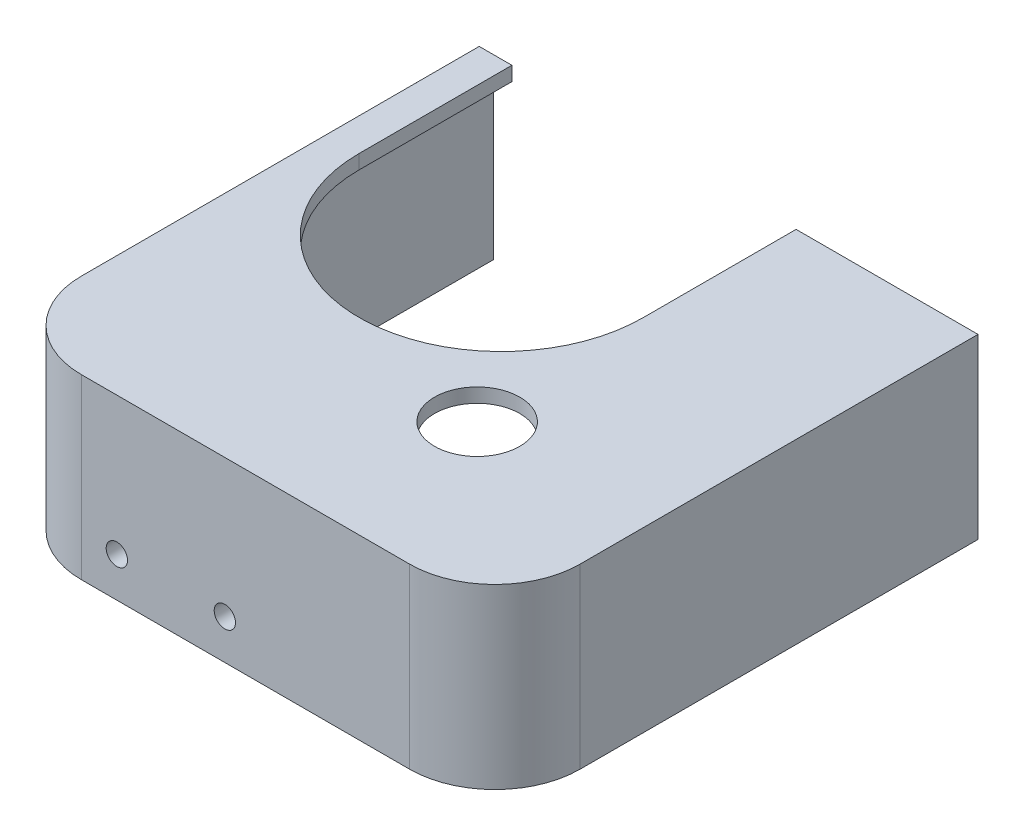
ISO-10303-21;
HEADER;
FILE_DESCRIPTION(('STEP AP214'),'2;1');
FILE_NAME('part.step','',(''),(''),'','','');
FILE_SCHEMA(('AUTOMOTIVE_DESIGN { 1 0 10303 214 1 1 1 1 }'));
ENDSEC;
DATA;
#1=APPLICATION_CONTEXT('core data for automotive mechanical design processes');
#2=APPLICATION_PROTOCOL_DEFINITION('international standard','automotive_design',2000,#1);
#3=PRODUCT_CONTEXT('',#1,'mechanical');
#4=PRODUCT('Part','Part','',(#3));
#5=PRODUCT_RELATED_PRODUCT_CATEGORY('part','',(#4));
#6=PRODUCT_DEFINITION_FORMATION('','',#4);
#7=PRODUCT_DEFINITION_CONTEXT('part definition',#1,'design');
#8=PRODUCT_DEFINITION('design','',#6,#7);
#9=PRODUCT_DEFINITION_SHAPE('','',#8);
#10=(LENGTH_UNIT() NAMED_UNIT(*) SI_UNIT(.MILLI.,.METRE.));
#11=(NAMED_UNIT(*) PLANE_ANGLE_UNIT() SI_UNIT($,.RADIAN.));
#12=(NAMED_UNIT(*) SI_UNIT($,.STERADIAN.) SOLID_ANGLE_UNIT());
#13=UNCERTAINTY_MEASURE_WITH_UNIT(LENGTH_MEASURE(1.E-05),#10,'distance_accuracy_value','');
#14=(GEOMETRIC_REPRESENTATION_CONTEXT(3) GLOBAL_UNCERTAINTY_ASSIGNED_CONTEXT((#13)) GLOBAL_UNIT_ASSIGNED_CONTEXT((#10,
#11,#12)) REPRESENTATION_CONTEXT('',''));
#15=CARTESIAN_POINT('',(0.,0.,0.));
#16=DIRECTION('',(0.,0.,1.));
#17=DIRECTION('',(1.,0.,0.));
#18=AXIS2_PLACEMENT_3D('',#15,#16,#17);
#19=CARTESIAN_POINT('',(-0.499999999999999,-13.5,-21.75));
#20=DIRECTION('',(-1.,0.,0.));
#21=DIRECTION('',(0.,0.,1.));
#22=AXIS2_PLACEMENT_3D('',#19,#20,#21);
#23=PLANE('',#22);
#24=DIRECTION('',(0.,-1.,0.));
#25=VECTOR('',#24,1.);
#26=CARTESIAN_POINT('',(-0.499999999999997,-13.5,-32.5));
#27=LINE('',#26,#25);
#28=CARTESIAN_POINT('',(-0.499999999999997,-12.5,-32.5));
#29=VERTEX_POINT('',#28);
#30=CARTESIAN_POINT('',(-0.499999999999997,-13.5,-32.5));
#31=VERTEX_POINT('',#30);
#32=EDGE_CURVE('E390',#29,#31,#27,.T.);
#33=ORIENTED_EDGE('',*,*,#32,.T.);
#34=DIRECTION('',(0.,0.,-1.));
#35=VECTOR('',#34,1.);
#36=CARTESIAN_POINT('',(-0.500000000000002,-13.5,-21.75));
#37=LINE('',#36,#35);
#38=CARTESIAN_POINT('',(-0.500000000000004,-13.5,-21.75));
#39=VERTEX_POINT('',#38);
#40=EDGE_CURVE('E232',#39,#31,#37,.T.);
#41=ORIENTED_EDGE('',*,*,#40,.F.);
#42=DIRECTION('',(0.,-1.,0.));
#43=VECTOR('',#42,1.);
#44=CARTESIAN_POINT('',(-0.5,-13.5,-21.75));
#45=LINE('',#44,#43);
#46=CARTESIAN_POINT('',(-0.5,-12.5,-21.75));
#47=VERTEX_POINT('',#46);
#48=EDGE_CURVE('E393',#47,#39,#45,.T.);
#49=ORIENTED_EDGE('',*,*,#48,.F.);
#50=DIRECTION('',(0.,0.,-1.));
#51=VECTOR('',#50,1.);
#52=CARTESIAN_POINT('',(-0.499999999999999,-12.5,-21.75));
#53=LINE('',#52,#51);
#54=EDGE_CURVE('E296',#47,#29,#53,.T.);
#55=ORIENTED_EDGE('',*,*,#54,.T.);
#56=EDGE_LOOP('',(#33,#41,#49,#55));
#57=FACE_BOUND('',#56,.T.);
#58=ADVANCED_FACE('F36',(#57),#23,.T.);
#59=CARTESIAN_POINT('',(-10.5,-13.5,-21.75));
#60=DIRECTION('',(0.,-1.,0.));
#61=DIRECTION('',(0.,0.,-1.));
#62=AXIS2_PLACEMENT_3D('',#59,#60,#61);
#63=CYLINDRICAL_SURFACE('',#62,10.);
#64=ORIENTED_EDGE('',*,*,#48,.T.);
#65=CARTESIAN_POINT('',(-10.5,-13.5,-21.75));
#66=DIRECTION('',(0.,1.,0.));
#67=DIRECTION('',(0.,0.,-1.));
#68=AXIS2_PLACEMENT_3D('',#65,#66,#67);
#69=CIRCLE('',#68,9.99999999999999);
#70=CARTESIAN_POINT('',(-20.5,-13.5,-21.75));
#71=VERTEX_POINT('',#70);
#72=EDGE_CURVE('E230',#71,#39,#69,.T.);
#73=ORIENTED_EDGE('',*,*,#72,.F.);
#74=DIRECTION('',(0.,-1.,0.));
#75=VECTOR('',#74,1.);
#76=CARTESIAN_POINT('',(-20.5,-13.5,-21.75));
#77=LINE('',#76,#75);
#78=CARTESIAN_POINT('',(-20.5,-12.5,-21.75));
#79=VERTEX_POINT('',#78);
#80=EDGE_CURVE('E396',#79,#71,#77,.T.);
#81=ORIENTED_EDGE('',*,*,#80,.F.);
#82=CARTESIAN_POINT('',(-10.5,-12.5,-21.75));
#83=DIRECTION('',(0.,1.,0.));
#84=DIRECTION('',(0.,0.,-1.));
#85=AXIS2_PLACEMENT_3D('',#82,#83,#84);
#86=CIRCLE('',#85,10.);
#87=EDGE_CURVE('E293',#79,#47,#86,.T.);
#88=ORIENTED_EDGE('',*,*,#87,.T.);
#89=EDGE_LOOP('',(#64,#73,#81,#88));
#90=FACE_BOUND('',#89,.T.);
#91=ADVANCED_FACE('F431',(#90),#63,.F.);
#92=CARTESIAN_POINT('',(-20.5,-13.5,-21.75));
#93=DIRECTION('',(1.,0.,0.));
#94=DIRECTION('',(0.,0.,-1.));
#95=AXIS2_PLACEMENT_3D('',#92,#93,#94);
#96=PLANE('',#95);
#97=ORIENTED_EDGE('',*,*,#80,.T.);
#98=DIRECTION('',(0.,0.,1.));
#99=VECTOR('',#98,1.);
#100=CARTESIAN_POINT('',(-20.5,-13.5,-32.5));
#101=LINE('',#100,#99);
#102=CARTESIAN_POINT('',(-20.5,-13.5,-32.5));
#103=VERTEX_POINT('',#102);
#104=EDGE_CURVE('E228',#103,#71,#101,.T.);
#105=ORIENTED_EDGE('',*,*,#104,.F.);
#106=DIRECTION('',(0.,-1.,0.));
#107=VECTOR('',#106,1.);
#108=CARTESIAN_POINT('',(-20.5,-13.5,-32.5));
#109=LINE('',#108,#107);
#110=CARTESIAN_POINT('',(-20.5,-12.5,-32.5));
#111=VERTEX_POINT('',#110);
#112=EDGE_CURVE('E386',#111,#103,#109,.T.);
#113=ORIENTED_EDGE('',*,*,#112,.F.);
#114=DIRECTION('',(0.,0.,1.));
#115=VECTOR('',#114,1.);
#116=CARTESIAN_POINT('',(-20.5,-12.5,-21.75));
#117=LINE('',#116,#115);
#118=EDGE_CURVE('E290',#111,#79,#117,.T.);
#119=ORIENTED_EDGE('',*,*,#118,.T.);
#120=EDGE_LOOP('',(#97,#105,#113,#119));
#121=FACE_BOUND('',#120,.T.);
#122=ADVANCED_FACE('F434',(#121),#96,.T.);
#123=CARTESIAN_POINT('',(0.,-15.5,-9.55499999999999));
#124=DIRECTION('',(0.,1.,0.));
#125=DIRECTION('',(0.,0.,1.));
#126=AXIS2_PLACEMENT_3D('',#123,#124,#125);
#127=CYLINDRICAL_SURFACE('',#126,3.);
#128=CARTESIAN_POINT('',(0.,-12.5,-9.55499999999999));
#129=DIRECTION('',(0.,-1.,0.));
#130=DIRECTION('',(0.,0.,-1.));
#131=AXIS2_PLACEMENT_3D('',#128,#129,#130);
#132=CIRCLE('',#131,3.);
#133=CARTESIAN_POINT('',(0.,-12.5,-12.555));
#134=VERTEX_POINT('',#133);
#135=EDGE_CURVE('E254',#134,#134,#132,.T.);
#136=ORIENTED_EDGE('',*,*,#135,.F.);
#137=EDGE_LOOP('',(#136));
#138=FACE_BOUND('',#137,.T.);
#139=CARTESIAN_POINT('',(0.,-13.5,-9.55499999999999));
#140=DIRECTION('',(0.,-1.,0.));
#141=DIRECTION('',(0.,0.,-1.));
#142=AXIS2_PLACEMENT_3D('',#139,#140,#141);
#143=CIRCLE('',#142,3.);
#144=CARTESIAN_POINT('',(0.,-13.5,-12.555));
#145=VERTEX_POINT('',#144);
#146=EDGE_CURVE('E40',#145,#145,#143,.F.);
#147=ORIENTED_EDGE('',*,*,#146,.F.);
#148=EDGE_LOOP('',(#147));
#149=FACE_BOUND('',#148,.T.);
#150=ADVANCED_FACE('F506',(#138,#149),#127,.F.);
#151=CARTESIAN_POINT('',(0.,0.,1.5));
#152=DIRECTION('',(0.,0.,1.));
#153=DIRECTION('',(1.,0.,0.));
#154=AXIS2_PLACEMENT_3D('',#151,#152,#153);
#155=PLANE('',#154);
#156=CARTESIAN_POINT('',(-6.7,-22.2,1.5));
#157=DIRECTION('',(0.,0.,-1.));
#158=DIRECTION('',(1.,0.,0.));
#159=AXIS2_PLACEMENT_3D('',#156,#157,#158);
#160=CIRCLE('',#159,0.749999999999998);
#161=CARTESIAN_POINT('',(-5.95,-22.2,1.5));
#162=VERTEX_POINT('',#161);
#163=EDGE_CURVE('E329',#162,#162,#160,.T.);
#164=ORIENTED_EDGE('',*,*,#163,.T.);
#165=EDGE_LOOP('',(#164));
#166=FACE_BOUND('',#165,.T.);
#167=CARTESIAN_POINT('',(-14.3,-22.2,1.5));
#168=DIRECTION('',(0.,0.,-1.));
#169=DIRECTION('',(1.,0.,0.));
#170=AXIS2_PLACEMENT_3D('',#167,#168,#169);
#171=CIRCLE('',#170,0.75);
#172=CARTESIAN_POINT('',(-13.55,-22.2,1.5));
#173=VERTEX_POINT('',#172);
#174=EDGE_CURVE('E315',#173,#173,#171,.T.);
#175=ORIENTED_EDGE('',*,*,#174,.T.);
#176=EDGE_LOOP('',(#175));
#177=FACE_BOUND('',#176,.T.);
#178=DIRECTION('',(0.,1.,0.));
#179=VECTOR('',#178,1.);
#180=CARTESIAN_POINT('',(6.3,0.,1.5));
#181=LINE('',#180,#179);
#182=CARTESIAN_POINT('',(6.3,-25.,1.5));
#183=VERTEX_POINT('',#182);
#184=CARTESIAN_POINT('',(6.3,-12.5,1.5));
#185=VERTEX_POINT('',#184);
#186=EDGE_CURVE('E45',#183,#185,#181,.T.);
#187=ORIENTED_EDGE('',*,*,#186,.T.);
#188=DIRECTION('',(1.,0.,0.));
#189=VECTOR('',#188,1.);
#190=CARTESIAN_POINT('',(-16.8,-12.5,1.5));
#191=LINE('',#190,#189);
#192=CARTESIAN_POINT('',(-16.8,-12.5,1.5));
#193=VERTEX_POINT('',#192);
#194=EDGE_CURVE('E245',#193,#185,#191,.T.);
#195=ORIENTED_EDGE('',*,*,#194,.F.);
#196=DIRECTION('',(0.,1.,0.));
#197=VECTOR('',#196,1.);
#198=CARTESIAN_POINT('',(-16.8,-14.5,1.5));
#199=LINE('',#198,#197);
#200=CARTESIAN_POINT('',(-16.8,-25.,1.5));
#201=VERTEX_POINT('',#200);
#202=EDGE_CURVE('E403',#193,#201,#199,.F.);
#203=ORIENTED_EDGE('',*,*,#202,.T.);
#204=DIRECTION('',(-1.,0.,0.));
#205=VECTOR('',#204,1.);
#206=CARTESIAN_POINT('',(-4.5,-25.,1.5));
#207=LINE('',#206,#205);
#208=EDGE_CURVE('E335',#183,#201,#207,.T.);
#209=ORIENTED_EDGE('',*,*,#208,.F.);
#210=EDGE_LOOP('',(#187,#195,#203,#209));
#211=FACE_BOUND('',#210,.T.);
#212=ADVANCED_FACE('F408',(#166,#177,#211),#155,.T.);
#213=CARTESIAN_POINT('',(12.3,-14.5,0.5));
#214=DIRECTION('',(1.,0.,0.));
#215=DIRECTION('',(0.,0.,-1.));
#216=AXIS2_PLACEMENT_3D('',#213,#214,#215);
#217=PLANE('',#216);
#218=DIRECTION('',(0.,-1.,0.));
#219=VECTOR('',#218,1.);
#220=CARTESIAN_POINT('',(12.3,-13.5,-32.5));
#221=LINE('',#220,#219);
#222=CARTESIAN_POINT('',(12.3,-12.5,-32.5));
#223=VERTEX_POINT('',#222);
#224=CARTESIAN_POINT('',(12.3,-25.,-32.5));
#225=VERTEX_POINT('',#224);
#226=EDGE_CURVE('E387',#223,#225,#221,.T.);
#227=ORIENTED_EDGE('',*,*,#226,.F.);
#228=DIRECTION('',(0.,0.,-1.));
#229=VECTOR('',#228,1.);
#230=CARTESIAN_POINT('',(12.3,-12.5,-4.5));
#231=LINE('',#230,#229);
#232=CARTESIAN_POINT('',(12.3,-12.5,-4.5));
#233=VERTEX_POINT('',#232);
#234=EDGE_CURVE('E249',#233,#223,#231,.T.);
#235=ORIENTED_EDGE('',*,*,#234,.F.);
#236=DIRECTION('',(0.,1.,0.));
#237=VECTOR('',#236,1.);
#238=CARTESIAN_POINT('',(12.3,-14.5,-4.5));
#239=LINE('',#238,#237);
#240=CARTESIAN_POINT('',(12.3,-25.,-4.5));
#241=VERTEX_POINT('',#240);
#242=EDGE_CURVE('E11',#233,#241,#239,.F.);
#243=ORIENTED_EDGE('',*,*,#242,.T.);
#244=DIRECTION('',(0.,0.,1.));
#245=VECTOR('',#244,1.);
#246=CARTESIAN_POINT('',(12.3,-25.,0.5));
#247=LINE('',#246,#245);
#248=EDGE_CURVE('E322',#225,#241,#247,.T.);
#249=ORIENTED_EDGE('',*,*,#248,.F.);
#250=EDGE_LOOP('',(#227,#235,#243,#249));
#251=FACE_BOUND('',#250,.T.);
#252=ADVANCED_FACE('F418',(#251),#217,.T.);
#253=CARTESIAN_POINT('',(-0.499999999999997,-13.5,-32.5));
#254=DIRECTION('',(0.,0.,-1.));
#255=DIRECTION('',(-1.,0.,0.));
#256=AXIS2_PLACEMENT_3D('',#253,#254,#255);
#257=PLANE('',#256);
#258=DIRECTION('',(0.,-1.,0.));
#259=VECTOR('',#258,1.);
#260=CARTESIAN_POINT('',(11.3,-25.,-32.5));
#261=LINE('',#260,#259);
#262=CARTESIAN_POINT('',(11.3,-13.5,-32.5));
#263=VERTEX_POINT('',#262);
#264=CARTESIAN_POINT('',(11.3,-25.,-32.5));
#265=VERTEX_POINT('',#264);
#266=EDGE_CURVE('E270',#263,#265,#261,.T.);
#267=ORIENTED_EDGE('',*,*,#266,.F.);
#268=DIRECTION('',(1.,0.,0.));
#269=VECTOR('',#268,1.);
#270=CARTESIAN_POINT('',(-0.499999999999997,-13.5,-32.5));
#271=LINE('',#270,#269);
#272=EDGE_CURVE('E234',#31,#263,#271,.T.);
#273=ORIENTED_EDGE('',*,*,#272,.F.);
#274=ORIENTED_EDGE('',*,*,#32,.F.);
#275=DIRECTION('',(1.,0.,0.));
#276=VECTOR('',#275,1.);
#277=CARTESIAN_POINT('',(-0.499999999999997,-12.5,-32.5));
#278=LINE('',#277,#276);
#279=EDGE_CURVE('E299',#29,#223,#278,.T.);
#280=ORIENTED_EDGE('',*,*,#279,.T.);
#281=ORIENTED_EDGE('',*,*,#226,.T.);
#282=DIRECTION('',(1.,0.,0.));
#283=VECTOR('',#282,1.);
#284=CARTESIAN_POINT('',(11.3,-25.,-32.5));
#285=LINE('',#284,#283);
#286=EDGE_CURVE('E275',#265,#225,#285,.T.);
#287=ORIENTED_EDGE('',*,*,#286,.F.);
#288=EDGE_LOOP('',(#267,#273,#274,#280,#281,#287));
#289=FACE_BOUND('',#288,.T.);
#290=ADVANCED_FACE('F421',(#289),#257,.T.);
#291=CARTESIAN_POINT('',(-21.8,-13.5,-32.5));
#292=DIRECTION('',(0.,0.,-1.));
#293=DIRECTION('',(-1.,0.,0.));
#294=AXIS2_PLACEMENT_3D('',#291,#292,#293);
#295=PLANE('',#294);
#296=DIRECTION('',(1.,0.,0.));
#297=VECTOR('',#296,1.);
#298=CARTESIAN_POINT('',(-21.8,-13.5,-32.5));
#299=LINE('',#298,#297);
#300=CARTESIAN_POINT('',(-21.8,-13.5,-32.5));
#301=VERTEX_POINT('',#300);
#302=EDGE_CURVE('E218',#301,#103,#299,.T.);
#303=ORIENTED_EDGE('',*,*,#302,.F.);
#304=DIRECTION('',(0.,1.,0.));
#305=VECTOR('',#304,1.);
#306=CARTESIAN_POINT('',(-21.8,-12.5,-32.5));
#307=LINE('',#306,#305);
#308=CARTESIAN_POINT('',(-21.8,-25.,-32.5));
#309=VERTEX_POINT('',#308);
#310=EDGE_CURVE('E215',#309,#301,#307,.T.);
#311=ORIENTED_EDGE('',*,*,#310,.F.);
#312=DIRECTION('',(1.,0.,0.));
#313=VECTOR('',#312,1.);
#314=CARTESIAN_POINT('',(-22.8,-25.,-32.5));
#315=LINE('',#314,#313);
#316=CARTESIAN_POINT('',(-22.8,-25.,-32.5));
#317=VERTEX_POINT('',#316);
#318=EDGE_CURVE('E282',#317,#309,#315,.T.);
#319=ORIENTED_EDGE('',*,*,#318,.F.);
#320=DIRECTION('',(0.,-1.,0.));
#321=VECTOR('',#320,1.);
#322=CARTESIAN_POINT('',(-22.8,-14.5,-32.5));
#323=LINE('',#322,#321);
#324=CARTESIAN_POINT('',(-22.8,-12.5,-32.5));
#325=VERTEX_POINT('',#324);
#326=EDGE_CURVE('E382',#325,#317,#323,.T.);
#327=ORIENTED_EDGE('',*,*,#326,.F.);
#328=DIRECTION('',(1.,0.,0.));
#329=VECTOR('',#328,1.);
#330=CARTESIAN_POINT('',(-21.8,-12.5,-32.5));
#331=LINE('',#330,#329);
#332=EDGE_CURVE('E287',#325,#111,#331,.T.);
#333=ORIENTED_EDGE('',*,*,#332,.T.);
#334=ORIENTED_EDGE('',*,*,#112,.T.);
#335=EDGE_LOOP('',(#303,#311,#319,#327,#333,#334));
#336=FACE_BOUND('',#335,.T.);
#337=ADVANCED_FACE('F443',(#336),#295,.T.);
#338=CARTESIAN_POINT('',(-22.8,0.,0.));
#339=DIRECTION('',(1.,0.,0.));
#340=DIRECTION('',(0.,0.,-1.));
#341=AXIS2_PLACEMENT_3D('',#338,#339,#340);
#342=PLANE('',#341);
#343=DIRECTION('',(0.,0.,1.));
#344=VECTOR('',#343,1.);
#345=CARTESIAN_POINT('',(-22.8,-12.5,-32.5));
#346=LINE('',#345,#344);
#347=CARTESIAN_POINT('',(-22.8,-12.5,-4.5));
#348=VERTEX_POINT('',#347);
#349=EDGE_CURVE('E252',#325,#348,#346,.T.);
#350=ORIENTED_EDGE('',*,*,#349,.F.);
#351=ORIENTED_EDGE('',*,*,#326,.T.);
#352=DIRECTION('',(0.,0.,-1.));
#353=VECTOR('',#352,1.);
#354=CARTESIAN_POINT('',(-22.8,-25.,-32.5));
#355=LINE('',#354,#353);
#356=CARTESIAN_POINT('',(-22.8,-25.,-4.5));
#357=VERTEX_POINT('',#356);
#358=EDGE_CURVE('E279',#357,#317,#355,.T.);
#359=ORIENTED_EDGE('',*,*,#358,.F.);
#360=DIRECTION('',(0.,1.,0.));
#361=VECTOR('',#360,1.);
#362=CARTESIAN_POINT('',(-22.8,-1.99999999999999,-4.5));
#363=LINE('',#362,#361);
#364=EDGE_CURVE('E389',#357,#348,#363,.T.);
#365=ORIENTED_EDGE('',*,*,#364,.T.);
#366=EDGE_LOOP('',(#350,#351,#359,#365));
#367=FACE_BOUND('',#366,.T.);
#368=ADVANCED_FACE('F440',(#367),#342,.F.);
#369=CARTESIAN_POINT('',(-16.8,0.,-4.5));
#370=DIRECTION('',(0.,-1.,0.));
#371=DIRECTION('',(0.,0.,-1.));
#372=AXIS2_PLACEMENT_3D('',#369,#370,#371);
#373=CYLINDRICAL_SURFACE('',#372,6.);
#374=ORIENTED_EDGE('',*,*,#202,.F.);
#375=CARTESIAN_POINT('',(-16.8,-12.5,-4.5));
#376=DIRECTION('',(0.,1.,0.));
#377=DIRECTION('',(-1.,0.,0.));
#378=AXIS2_PLACEMENT_3D('',#375,#376,#377);
#379=CIRCLE('',#378,6.);
#380=EDGE_CURVE('E243',#348,#193,#379,.T.);
#381=ORIENTED_EDGE('',*,*,#380,.F.);
#382=ORIENTED_EDGE('',*,*,#364,.F.);
#383=CARTESIAN_POINT('',(-16.8,-25.,-4.5));
#384=DIRECTION('',(0.,-1.,0.));
#385=DIRECTION('',(0.,0.,-1.));
#386=AXIS2_PLACEMENT_3D('',#383,#384,#385);
#387=CIRCLE('',#386,6.);
#388=EDGE_CURVE('E371',#357,#201,#387,.F.);
#389=ORIENTED_EDGE('',*,*,#388,.T.);
#390=EDGE_LOOP('',(#374,#381,#382,#389));
#391=FACE_BOUND('',#390,.T.);
#392=ADVANCED_FACE('F513',(#391),#373,.T.);
#393=CARTESIAN_POINT('',(6.3,0.,-4.5));
#394=DIRECTION('',(0.,1.,0.));
#395=DIRECTION('',(0.,0.,1.));
#396=AXIS2_PLACEMENT_3D('',#393,#394,#395);
#397=CYLINDRICAL_SURFACE('',#396,6.);
#398=ORIENTED_EDGE('',*,*,#242,.F.);
#399=CARTESIAN_POINT('',(6.3,-12.5,-4.5));
#400=DIRECTION('',(0.,1.,0.));
#401=DIRECTION('',(-1.,0.,0.));
#402=AXIS2_PLACEMENT_3D('',#399,#400,#401);
#403=CIRCLE('',#402,6.);
#404=EDGE_CURVE('E247',#185,#233,#403,.T.);
#405=ORIENTED_EDGE('',*,*,#404,.F.);
#406=ORIENTED_EDGE('',*,*,#186,.F.);
#407=CARTESIAN_POINT('',(6.3,-25.,-4.5));
#408=DIRECTION('',(0.,-1.,0.));
#409=DIRECTION('',(0.,0.,-1.));
#410=AXIS2_PLACEMENT_3D('',#407,#408,#409);
#411=CIRCLE('',#410,6.);
#412=EDGE_CURVE('E380',#183,#241,#411,.F.);
#413=ORIENTED_EDGE('',*,*,#412,.T.);
#414=EDGE_LOOP('',(#398,#405,#406,#413));
#415=FACE_BOUND('',#414,.T.);
#416=ADVANCED_FACE('F38',(#415),#397,.T.);
#417=CARTESIAN_POINT('',(-21.8,-12.5,0.5));
#418=DIRECTION('',(0.,1.,0.));
#419=DIRECTION('',(0.,0.,-1.));
#420=AXIS2_PLACEMENT_3D('',#417,#418,#419);
#421=PLANE('',#420);
#422=ORIENTED_EDGE('',*,*,#332,.F.);
#423=ORIENTED_EDGE('',*,*,#349,.T.);
#424=ORIENTED_EDGE('',*,*,#380,.T.);
#425=ORIENTED_EDGE('',*,*,#194,.T.);
#426=ORIENTED_EDGE('',*,*,#404,.T.);
#427=ORIENTED_EDGE('',*,*,#234,.T.);
#428=ORIENTED_EDGE('',*,*,#279,.F.);
#429=ORIENTED_EDGE('',*,*,#54,.F.);
#430=ORIENTED_EDGE('',*,*,#87,.F.);
#431=ORIENTED_EDGE('',*,*,#118,.F.);
#432=EDGE_LOOP('',(#422,#423,#424,#425,#426,#427,#428,#429,#430,#431));
#433=FACE_BOUND('',#432,.T.);
#434=ORIENTED_EDGE('',*,*,#135,.T.);
#435=EDGE_LOOP('',(#434));
#436=FACE_BOUND('',#435,.T.);
#437=ADVANCED_FACE('F414',(#433,#436),#421,.T.);
#438=CARTESIAN_POINT('',(0.,-27.,0.5));
#439=DIRECTION('',(0.,0.,1.));
#440=DIRECTION('',(1.,0.,0.));
#441=AXIS2_PLACEMENT_3D('',#438,#439,#440);
#442=PLANE('',#441);
#443=DIRECTION('',(0.,1.,0.));
#444=VECTOR('',#443,1.);
#445=CARTESIAN_POINT('',(-16.8,-27.,0.5));
#446=LINE('',#445,#444);
#447=CARTESIAN_POINT('',(-16.8,-13.5,0.5));
#448=VERTEX_POINT('',#447);
#449=CARTESIAN_POINT('',(-16.8,-25.,0.5));
#450=VERTEX_POINT('',#449);
#451=EDGE_CURVE('E209',#448,#450,#446,.F.);
#452=ORIENTED_EDGE('',*,*,#451,.F.);
#453=DIRECTION('',(-1.,0.,0.));
#454=VECTOR('',#453,1.);
#455=CARTESIAN_POINT('',(6.3,-13.5,0.5));
#456=LINE('',#455,#454);
#457=CARTESIAN_POINT('',(6.3,-13.5,0.5));
#458=VERTEX_POINT('',#457);
#459=EDGE_CURVE('E224',#458,#448,#456,.T.);
#460=ORIENTED_EDGE('',*,*,#459,.F.);
#461=DIRECTION('',(0.,-1.,0.));
#462=VECTOR('',#461,1.);
#463=CARTESIAN_POINT('',(6.3,-13.5,0.5));
#464=LINE('',#463,#462);
#465=CARTESIAN_POINT('',(6.3,-25.,0.5));
#466=VERTEX_POINT('',#465);
#467=EDGE_CURVE('E376',#466,#458,#464,.F.);
#468=ORIENTED_EDGE('',*,*,#467,.F.);
#469=DIRECTION('',(-1.,0.,0.));
#470=VECTOR('',#469,1.);
#471=CARTESIAN_POINT('',(12.3,-25.,0.5));
#472=LINE('',#471,#470);
#473=CARTESIAN_POINT('',(-4.5,-25.,0.5));
#474=VERTEX_POINT('',#473);
#475=EDGE_CURVE('E319',#466,#474,#472,.T.);
#476=ORIENTED_EDGE('',*,*,#475,.T.);
#477=DIRECTION('',(0.,-1.,0.));
#478=VECTOR('',#477,1.);
#479=CARTESIAN_POINT('',(-4.5,-19.,0.5));
#480=LINE('',#479,#478);
#481=CARTESIAN_POINT('',(-4.5,-17.,0.5));
#482=VERTEX_POINT('',#481);
#483=EDGE_CURVE('E325',#482,#474,#480,.T.);
#484=ORIENTED_EDGE('',*,*,#483,.F.);
#485=DIRECTION('',(1.,0.,0.));
#486=VECTOR('',#485,1.);
#487=CARTESIAN_POINT('',(-4.5,-17.,0.5));
#488=LINE('',#487,#486);
#489=CARTESIAN_POINT('',(-16.5,-17.,0.5));
#490=VERTEX_POINT('',#489);
#491=EDGE_CURVE('E352',#490,#482,#488,.T.);
#492=ORIENTED_EDGE('',*,*,#491,.F.);
#493=DIRECTION('',(0.,-1.,0.));
#494=VECTOR('',#493,1.);
#495=CARTESIAN_POINT('',(-16.5,-27.,0.5));
#496=LINE('',#495,#494);
#497=CARTESIAN_POINT('',(-16.5,-25.,0.5));
#498=VERTEX_POINT('',#497);
#499=EDGE_CURVE('E349',#490,#498,#496,.T.);
#500=ORIENTED_EDGE('',*,*,#499,.T.);
#501=EDGE_CURVE('E318',#498,#450,#472,.T.);
#502=ORIENTED_EDGE('',*,*,#501,.T.);
#503=EDGE_LOOP('',(#452,#460,#468,#476,#484,#492,#500,#502));
#504=FACE_BOUND('',#503,.T.);
#505=ADVANCED_FACE('F447',(#504),#442,.F.);
#506=CARTESIAN_POINT('',(-4.5,-19.,1.5));
#507=DIRECTION('',(-1.,0.,0.));
#508=DIRECTION('',(0.,0.,1.));
#509=AXIS2_PLACEMENT_3D('',#506,#507,#508);
#510=PLANE('',#509);
#511=ORIENTED_EDGE('',*,*,#483,.T.);
#512=DIRECTION('',(0.,0.,-1.));
#513=VECTOR('',#512,1.);
#514=CARTESIAN_POINT('',(-4.5,-25.,1.5));
#515=LINE('',#514,#513);
#516=CARTESIAN_POINT('',(-4.5,-25.,0.));
#517=VERTEX_POINT('',#516);
#518=EDGE_CURVE('E338',#474,#517,#515,.T.);
#519=ORIENTED_EDGE('',*,*,#518,.T.);
#520=DIRECTION('',(0.,-1.,0.));
#521=VECTOR('',#520,1.);
#522=CARTESIAN_POINT('',(-4.5,-19.,0.));
#523=LINE('',#522,#521);
#524=CARTESIAN_POINT('',(-4.5,-18.3228756555323,0.));
#525=VERTEX_POINT('',#524);
#526=EDGE_CURVE('E339',#525,#517,#523,.T.);
#527=ORIENTED_EDGE('',*,*,#526,.F.);
#528=CARTESIAN_POINT('',(-4.5,-17.,-1.5));
#529=DIRECTION('',(1.,0.,0.));
#530=DIRECTION('',(0.,0.,1.));
#531=AXIS2_PLACEMENT_3D('',#528,#529,#530);
#532=CIRCLE('',#531,2.);
#533=EDGE_CURVE('E355',#482,#525,#532,.T.);
#534=ORIENTED_EDGE('',*,*,#533,.F.);
#535=EDGE_LOOP('',(#511,#519,#527,#534));
#536=FACE_BOUND('',#535,.T.);
#537=ADVANCED_FACE('F477',(#536),#510,.F.);
#538=CARTESIAN_POINT('',(0.,-27.,0.));
#539=DIRECTION('',(0.,0.,1.));
#540=DIRECTION('',(1.,0.,0.));
#541=AXIS2_PLACEMENT_3D('',#538,#539,#540);
#542=PLANE('',#541);
#543=DIRECTION('',(-1.,0.,0.));
#544=VECTOR('',#543,1.);
#545=CARTESIAN_POINT('',(-4.5,-25.,0.));
#546=LINE('',#545,#544);
#547=CARTESIAN_POINT('',(-8.89951320303617,-25.,0.));
#548=VERTEX_POINT('',#547);
#549=EDGE_CURVE('E332',#517,#548,#546,.T.);
#550=ORIENTED_EDGE('',*,*,#549,.T.);
#551=DIRECTION('',(0.,1.,0.));
#552=VECTOR('',#551,1.);
#553=CARTESIAN_POINT('',(-8.89951320303617,-25.,0.));
#554=LINE('',#553,#552);
#555=CARTESIAN_POINT('',(-8.89951320303618,-18.3228756555323,0.));
#556=VERTEX_POINT('',#555);
#557=EDGE_CURVE('E342',#548,#556,#554,.T.);
#558=ORIENTED_EDGE('',*,*,#557,.T.);
#559=DIRECTION('',(-1.,0.,0.));
#560=VECTOR('',#559,1.);
#561=CARTESIAN_POINT('',(-4.5,-18.3228756555323,0.));
#562=LINE('',#561,#560);
#563=EDGE_CURVE('E358',#525,#556,#562,.T.);
#564=ORIENTED_EDGE('',*,*,#563,.F.);
#565=ORIENTED_EDGE('',*,*,#526,.T.);
#566=EDGE_LOOP('',(#550,#558,#564,#565));
#567=FACE_BOUND('',#566,.T.);
#568=CARTESIAN_POINT('',(-6.7,-22.2,0.));
#569=DIRECTION('',(0.,0.,-1.));
#570=DIRECTION('',(1.,0.,0.));
#571=AXIS2_PLACEMENT_3D('',#568,#569,#570);
#572=CIRCLE('',#571,0.749999999999998);
#573=CARTESIAN_POINT('',(-5.95,-22.2,0.));
#574=VERTEX_POINT('',#573);
#575=EDGE_CURVE('E328',#574,#574,#572,.T.);
#576=ORIENTED_EDGE('',*,*,#575,.F.);
#577=EDGE_LOOP('',(#576));
#578=FACE_BOUND('',#577,.T.);
#579=ADVANCED_FACE('F473',(#567,#578),#542,.F.);
#580=CARTESIAN_POINT('',(-4.5,-25.,1.5));
#581=DIRECTION('',(0.,1.,0.));
#582=DIRECTION('',(0.,0.,-1.));
#583=AXIS2_PLACEMENT_3D('',#580,#581,#582);
#584=PLANE('',#583);
#585=ORIENTED_EDGE('',*,*,#208,.T.);
#586=ORIENTED_EDGE('',*,*,#388,.F.);
#587=ORIENTED_EDGE('',*,*,#358,.T.);
#588=ORIENTED_EDGE('',*,*,#318,.T.);
#589=DIRECTION('',(0.,0.,-1.));
#590=VECTOR('',#589,1.);
#591=CARTESIAN_POINT('',(-21.8,-25.,-32.5));
#592=LINE('',#591,#590);
#593=CARTESIAN_POINT('',(-21.8,-25.,-4.5));
#594=VERTEX_POINT('',#593);
#595=EDGE_CURVE('E278',#594,#309,#592,.T.);
#596=ORIENTED_EDGE('',*,*,#595,.F.);
#597=CARTESIAN_POINT('',(-16.8,-25.,-4.5));
#598=DIRECTION('',(0.,-1.,0.));
#599=DIRECTION('',(0.,0.,-1.));
#600=AXIS2_PLACEMENT_3D('',#597,#598,#599);
#601=CIRCLE('',#600,5.);
#602=EDGE_CURVE('E205',#450,#594,#601,.T.);
#603=ORIENTED_EDGE('',*,*,#602,.F.);
#604=ORIENTED_EDGE('',*,*,#501,.F.);
#605=DIRECTION('',(0.,0.,-1.));
#606=VECTOR('',#605,1.);
#607=CARTESIAN_POINT('',(-16.5,-25.,1.5));
#608=LINE('',#607,#606);
#609=CARTESIAN_POINT('',(-16.5,-25.,0.));
#610=VERTEX_POINT('',#609);
#611=EDGE_CURVE('E312',#498,#610,#608,.T.);
#612=ORIENTED_EDGE('',*,*,#611,.T.);
#613=DIRECTION('',(-1.,0.,0.));
#614=VECTOR('',#613,1.);
#615=CARTESIAN_POINT('',(-12.1004867969638,-25.,0.));
#616=LINE('',#615,#614);
#617=CARTESIAN_POINT('',(-12.1004867969638,-25.,0.));
#618=VERTEX_POINT('',#617);
#619=EDGE_CURVE('E304',#618,#610,#616,.T.);
#620=ORIENTED_EDGE('',*,*,#619,.F.);
#621=DIRECTION('',(0.,0.,1.));
#622=VECTOR('',#621,1.);
#623=CARTESIAN_POINT('',(-12.1004867969638,-25.,-1.5));
#624=LINE('',#623,#622);
#625=CARTESIAN_POINT('',(-12.1004867969638,-25.,-1.5));
#626=VERTEX_POINT('',#625);
#627=EDGE_CURVE('E265',#626,#618,#624,.T.);
#628=ORIENTED_EDGE('',*,*,#627,.F.);
#629=DIRECTION('',(1.,0.,0.));
#630=VECTOR('',#629,1.);
#631=CARTESIAN_POINT('',(-12.1004867969638,-25.,-1.5));
#632=LINE('',#631,#630);
#633=CARTESIAN_POINT('',(-8.89951320303618,-25.,-1.5));
#634=VERTEX_POINT('',#633);
#635=EDGE_CURVE('E255',#626,#634,#632,.T.);
#636=ORIENTED_EDGE('',*,*,#635,.T.);
#637=DIRECTION('',(0.,0.,1.));
#638=VECTOR('',#637,1.);
#639=CARTESIAN_POINT('',(-8.89951320303618,-25.,-1.5));
#640=LINE('',#639,#638);
#641=EDGE_CURVE('E268',#634,#548,#640,.T.);
#642=ORIENTED_EDGE('',*,*,#641,.T.);
#643=ORIENTED_EDGE('',*,*,#549,.F.);
#644=ORIENTED_EDGE('',*,*,#518,.F.);
#645=ORIENTED_EDGE('',*,*,#475,.F.);
#646=CARTESIAN_POINT('',(6.3,-25.,-4.5));
#647=DIRECTION('',(0.,-1.,0.));
#648=DIRECTION('',(0.,0.,-1.));
#649=AXIS2_PLACEMENT_3D('',#646,#647,#648);
#650=CIRCLE('',#649,5.);
#651=CARTESIAN_POINT('',(11.3,-25.,-4.5));
#652=VERTEX_POINT('',#651);
#653=EDGE_CURVE('E378',#652,#466,#650,.T.);
#654=ORIENTED_EDGE('',*,*,#653,.F.);
#655=DIRECTION('',(0.,0.,1.));
#656=VECTOR('',#655,1.);
#657=CARTESIAN_POINT('',(11.3,-25.,1.5));
#658=LINE('',#657,#656);
#659=EDGE_CURVE('E272',#265,#652,#658,.T.);
#660=ORIENTED_EDGE('',*,*,#659,.F.);
#661=ORIENTED_EDGE('',*,*,#286,.T.);
#662=ORIENTED_EDGE('',*,*,#248,.T.);
#663=ORIENTED_EDGE('',*,*,#412,.F.);
#664=EDGE_LOOP('',(#585,#586,#587,#588,#596,#603,#604,#612,#620,#628,#636,#642,#643,#644,#645,
#654,#660,#661,#662,#663));
#665=FACE_BOUND('',#664,.T.);
#666=ADVANCED_FACE('F412',(#665),#584,.F.);
#667=CARTESIAN_POINT('',(-6.7,-22.2,1.5));
#668=DIRECTION('',(0.,0.,-1.));
#669=DIRECTION('',(-1.,0.,0.));
#670=AXIS2_PLACEMENT_3D('',#667,#668,#669);
#671=CYLINDRICAL_SURFACE('',#670,0.749999999999998);
#672=ORIENTED_EDGE('',*,*,#163,.F.);
#673=EDGE_LOOP('',(#672));
#674=FACE_BOUND('',#673,.T.);
#675=ORIENTED_EDGE('',*,*,#575,.T.);
#676=EDGE_LOOP('',(#675));
#677=FACE_BOUND('',#676,.T.);
#678=ADVANCED_FACE('F536',(#674,#677),#671,.F.);
#679=CARTESIAN_POINT('',(-14.3,-22.2,0.5));
#680=DIRECTION('',(0.,0.,1.));
#681=DIRECTION('',(1.,0.,0.));
#682=AXIS2_PLACEMENT_3D('',#679,#680,#681);
#683=CYLINDRICAL_SURFACE('',#682,0.75);
#684=ORIENTED_EDGE('',*,*,#174,.F.);
#685=EDGE_LOOP('',(#684));
#686=FACE_BOUND('',#685,.T.);
#687=CARTESIAN_POINT('',(-14.3,-22.2,0.));
#688=DIRECTION('',(0.,0.,-1.));
#689=DIRECTION('',(1.,0.,0.));
#690=AXIS2_PLACEMENT_3D('',#687,#688,#689);
#691=CIRCLE('',#690,0.75);
#692=CARTESIAN_POINT('',(-13.55,-22.2,0.));
#693=VERTEX_POINT('',#692);
#694=EDGE_CURVE('E301',#693,#693,#691,.T.);
#695=ORIENTED_EDGE('',*,*,#694,.T.);
#696=EDGE_LOOP('',(#695));
#697=FACE_BOUND('',#696,.T.);
#698=ADVANCED_FACE('F543',(#686,#697),#683,.F.);
#699=CARTESIAN_POINT('',(-16.5,-25.,1.5));
#700=DIRECTION('',(1.,0.,0.));
#701=DIRECTION('',(0.,0.,-1.));
#702=AXIS2_PLACEMENT_3D('',#699,#700,#701);
#703=PLANE('',#702);
#704=DIRECTION('',(0.,1.,0.));
#705=VECTOR('',#704,1.);
#706=CARTESIAN_POINT('',(-16.5,-25.,0.));
#707=LINE('',#706,#705);
#708=CARTESIAN_POINT('',(-16.5,-18.3228756555323,0.));
#709=VERTEX_POINT('',#708);
#710=EDGE_CURVE('E307',#610,#709,#707,.T.);
#711=ORIENTED_EDGE('',*,*,#710,.F.);
#712=ORIENTED_EDGE('',*,*,#611,.F.);
#713=ORIENTED_EDGE('',*,*,#499,.F.);
#714=CARTESIAN_POINT('',(-16.5,-17.,-1.5));
#715=DIRECTION('',(-1.,0.,0.));
#716=DIRECTION('',(0.,0.,-1.));
#717=AXIS2_PLACEMENT_3D('',#714,#715,#716);
#718=CIRCLE('',#717,2.);
#719=EDGE_CURVE('E210',#709,#490,#718,.T.);
#720=ORIENTED_EDGE('',*,*,#719,.F.);
#721=EDGE_LOOP('',(#711,#712,#713,#720));
#722=FACE_BOUND('',#721,.T.);
#723=ADVANCED_FACE('F453',(#722),#703,.F.);
#724=CARTESIAN_POINT('',(0.,-27.,0.));
#725=DIRECTION('',(0.,0.,1.));
#726=DIRECTION('',(1.,0.,0.));
#727=AXIS2_PLACEMENT_3D('',#724,#725,#726);
#728=PLANE('',#727);
#729=ORIENTED_EDGE('',*,*,#619,.T.);
#730=ORIENTED_EDGE('',*,*,#710,.T.);
#731=DIRECTION('',(-1.,0.,0.));
#732=VECTOR('',#731,1.);
#733=CARTESIAN_POINT('',(-12.1004867969638,-18.3228756555323,0.));
#734=LINE('',#733,#732);
#735=CARTESIAN_POINT('',(-12.1004867969638,-18.3228756555323,0.));
#736=VERTEX_POINT('',#735);
#737=EDGE_CURVE('E366',#736,#709,#734,.T.);
#738=ORIENTED_EDGE('',*,*,#737,.F.);
#739=DIRECTION('',(0.,-1.,0.));
#740=VECTOR('',#739,1.);
#741=CARTESIAN_POINT('',(-12.1004867969638,-19.,0.));
#742=LINE('',#741,#740);
#743=EDGE_CURVE('E310',#736,#618,#742,.T.);
#744=ORIENTED_EDGE('',*,*,#743,.T.);
#745=EDGE_LOOP('',(#729,#730,#738,#744));
#746=FACE_BOUND('',#745,.T.);
#747=ORIENTED_EDGE('',*,*,#694,.F.);
#748=EDGE_LOOP('',(#747));
#749=FACE_BOUND('',#748,.T.);
#750=ADVANCED_FACE('F457',(#746,#749),#728,.F.);
#751=CARTESIAN_POINT('',(-21.8,-27.,0.));
#752=DIRECTION('',(1.,0.,0.));
#753=DIRECTION('',(0.,0.,-1.));
#754=AXIS2_PLACEMENT_3D('',#751,#752,#753);
#755=PLANE('',#754);
#756=ORIENTED_EDGE('',*,*,#310,.T.);
#757=DIRECTION('',(0.,0.,-1.));
#758=VECTOR('',#757,1.);
#759=CARTESIAN_POINT('',(-21.8,-13.5,-4.5));
#760=LINE('',#759,#758);
#761=CARTESIAN_POINT('',(-21.8,-13.5,-4.5));
#762=VERTEX_POINT('',#761);
#763=EDGE_CURVE('E213',#762,#301,#760,.T.);
#764=ORIENTED_EDGE('',*,*,#763,.F.);
#765=DIRECTION('',(0.,1.,0.));
#766=VECTOR('',#765,1.);
#767=CARTESIAN_POINT('',(-21.8,-27.,-4.5));
#768=LINE('',#767,#766);
#769=EDGE_CURVE('E198',#594,#762,#768,.T.);
#770=ORIENTED_EDGE('',*,*,#769,.F.);
#771=ORIENTED_EDGE('',*,*,#595,.T.);
#772=EDGE_LOOP('',(#756,#764,#770,#771));
#773=FACE_BOUND('',#772,.T.);
#774=ADVANCED_FACE('F214',(#773),#755,.T.);
#775=CARTESIAN_POINT('',(11.3,-27.,0.));
#776=DIRECTION('',(1.,0.,0.));
#777=DIRECTION('',(0.,0.,-1.));
#778=AXIS2_PLACEMENT_3D('',#775,#776,#777);
#779=PLANE('',#778);
#780=DIRECTION('',(0.,-1.,0.));
#781=VECTOR('',#780,1.);
#782=CARTESIAN_POINT('',(11.3,-25.,-4.5));
#783=LINE('',#782,#781);
#784=CARTESIAN_POINT('',(11.3,-13.5,-4.5));
#785=VERTEX_POINT('',#784);
#786=EDGE_CURVE('E374',#785,#652,#783,.T.);
#787=ORIENTED_EDGE('',*,*,#786,.F.);
#788=DIRECTION('',(0.,0.,1.));
#789=VECTOR('',#788,1.);
#790=CARTESIAN_POINT('',(11.3,-13.5,-32.5));
#791=LINE('',#790,#789);
#792=EDGE_CURVE('E237',#263,#785,#791,.T.);
#793=ORIENTED_EDGE('',*,*,#792,.F.);
#794=ORIENTED_EDGE('',*,*,#266,.T.);
#795=ORIENTED_EDGE('',*,*,#659,.T.);
#796=EDGE_LOOP('',(#787,#793,#794,#795));
#797=FACE_BOUND('',#796,.T.);
#798=ADVANCED_FACE('F486',(#797),#779,.F.);
#799=CARTESIAN_POINT('',(-8.89951320303618,-25.,-1.5));
#800=DIRECTION('',(-1.,0.,0.));
#801=DIRECTION('',(0.,0.,1.));
#802=AXIS2_PLACEMENT_3D('',#799,#800,#801);
#803=PLANE('',#802);
#804=ORIENTED_EDGE('',*,*,#641,.F.);
#805=DIRECTION('',(0.,1.,0.));
#806=VECTOR('',#805,1.);
#807=CARTESIAN_POINT('',(-8.89951320303618,-25.,-1.5));
#808=LINE('',#807,#806);
#809=CARTESIAN_POINT('',(-8.89951320303618,-19.,-1.5));
#810=VERTEX_POINT('',#809);
#811=EDGE_CURVE('E258',#634,#810,#808,.T.);
#812=ORIENTED_EDGE('',*,*,#811,.T.);
#813=CARTESIAN_POINT('',(-8.89951320303618,-17.,-1.5));
#814=DIRECTION('',(1.,0.,0.));
#815=DIRECTION('',(0.,0.,1.));
#816=AXIS2_PLACEMENT_3D('',#813,#814,#815);
#817=CIRCLE('',#816,2.);
#818=EDGE_CURVE('E361',#556,#810,#817,.T.);
#819=ORIENTED_EDGE('',*,*,#818,.F.);
#820=ORIENTED_EDGE('',*,*,#557,.F.);
#821=EDGE_LOOP('',(#804,#812,#819,#820));
#822=FACE_BOUND('',#821,.T.);
#823=ADVANCED_FACE('F471',(#822),#803,.F.);
#824=CARTESIAN_POINT('',(-12.1004867969638,-19.,-1.5));
#825=DIRECTION('',(1.,0.,0.));
#826=DIRECTION('',(0.,0.,-1.));
#827=AXIS2_PLACEMENT_3D('',#824,#825,#826);
#828=PLANE('',#827);
#829=DIRECTION('',(0.,-1.,0.));
#830=VECTOR('',#829,1.);
#831=CARTESIAN_POINT('',(-12.1004867969638,-19.,-1.5));
#832=LINE('',#831,#830);
#833=CARTESIAN_POINT('',(-12.1004867969638,-19.,-1.5));
#834=VERTEX_POINT('',#833);
#835=EDGE_CURVE('E263',#834,#626,#832,.T.);
#836=ORIENTED_EDGE('',*,*,#835,.T.);
#837=ORIENTED_EDGE('',*,*,#627,.T.);
#838=ORIENTED_EDGE('',*,*,#743,.F.);
#839=CARTESIAN_POINT('',(-12.1004867969638,-17.,-1.5));
#840=DIRECTION('',(-1.,0.,0.));
#841=DIRECTION('',(0.,0.,-1.));
#842=AXIS2_PLACEMENT_3D('',#839,#840,#841);
#843=CIRCLE('',#842,2.);
#844=EDGE_CURVE('E364',#834,#736,#843,.T.);
#845=ORIENTED_EDGE('',*,*,#844,.F.);
#846=EDGE_LOOP('',(#836,#837,#838,#845));
#847=FACE_BOUND('',#846,.T.);
#848=ADVANCED_FACE('F463',(#847),#828,.F.);
#849=CARTESIAN_POINT('',(0.,-27.,-1.5));
#850=DIRECTION('',(0.,0.,-1.));
#851=DIRECTION('',(-1.,0.,0.));
#852=AXIS2_PLACEMENT_3D('',#849,#850,#851);
#853=PLANE('',#852);
#854=ORIENTED_EDGE('',*,*,#635,.F.);
#855=ORIENTED_EDGE('',*,*,#835,.F.);
#856=DIRECTION('',(-1.,0.,0.));
#857=VECTOR('',#856,1.);
#858=CARTESIAN_POINT('',(-8.89951320303618,-19.,-1.5));
#859=LINE('',#858,#857);
#860=EDGE_CURVE('E261',#810,#834,#859,.T.);
#861=ORIENTED_EDGE('',*,*,#860,.F.);
#862=ORIENTED_EDGE('',*,*,#811,.F.);
#863=EDGE_LOOP('',(#854,#855,#861,#862));
#864=FACE_BOUND('',#863,.T.);
#865=ADVANCED_FACE('F467',(#864),#853,.T.);
#866=CARTESIAN_POINT('',(0.,-17.,-1.5));
#867=DIRECTION('',(-1.,0.,0.));
#868=DIRECTION('',(0.,0.,1.));
#869=AXIS2_PLACEMENT_3D('',#866,#867,#868);
#870=CYLINDRICAL_SURFACE('',#869,2.);
#871=ORIENTED_EDGE('',*,*,#844,.T.);
#872=ORIENTED_EDGE('',*,*,#737,.T.);
#873=ORIENTED_EDGE('',*,*,#719,.T.);
#874=ORIENTED_EDGE('',*,*,#491,.T.);
#875=ORIENTED_EDGE('',*,*,#533,.T.);
#876=ORIENTED_EDGE('',*,*,#563,.T.);
#877=ORIENTED_EDGE('',*,*,#818,.T.);
#878=ORIENTED_EDGE('',*,*,#860,.T.);
#879=EDGE_LOOP('',(#871,#872,#873,#874,#875,#876,#877,#878));
#880=FACE_BOUND('',#879,.T.);
#881=ADVANCED_FACE('F530',(#880),#870,.F.);
#882=CARTESIAN_POINT('',(-16.8,-27.,-4.5));
#883=DIRECTION('',(0.,1.,0.));
#884=DIRECTION('',(0.,0.,-1.));
#885=AXIS2_PLACEMENT_3D('',#882,#883,#884);
#886=CYLINDRICAL_SURFACE('',#885,5.);
#887=ORIENTED_EDGE('',*,*,#769,.T.);
#888=CARTESIAN_POINT('',(-16.8,-13.5,-4.5));
#889=DIRECTION('',(0.,-1.,0.));
#890=DIRECTION('',(0.,0.,-1.));
#891=AXIS2_PLACEMENT_3D('',#888,#889,#890);
#892=CIRCLE('',#891,5.);
#893=EDGE_CURVE('E202',#448,#762,#892,.T.);
#894=ORIENTED_EDGE('',*,*,#893,.F.);
#895=ORIENTED_EDGE('',*,*,#451,.T.);
#896=ORIENTED_EDGE('',*,*,#602,.T.);
#897=EDGE_LOOP('',(#887,#894,#895,#896));
#898=FACE_BOUND('',#897,.T.);
#899=ADVANCED_FACE('F200',(#898),#886,.F.);
#900=CARTESIAN_POINT('',(6.3,-27.,-4.5));
#901=DIRECTION('',(0.,1.,0.));
#902=DIRECTION('',(0.,0.,-1.));
#903=AXIS2_PLACEMENT_3D('',#900,#901,#902);
#904=CYLINDRICAL_SURFACE('',#903,5.);
#905=ORIENTED_EDGE('',*,*,#467,.T.);
#906=CARTESIAN_POINT('',(6.3,-13.5,-4.5));
#907=DIRECTION('',(0.,-1.,0.));
#908=DIRECTION('',(0.,0.,-1.));
#909=AXIS2_PLACEMENT_3D('',#906,#907,#908);
#910=CIRCLE('',#909,5.);
#911=EDGE_CURVE('E240',#785,#458,#910,.T.);
#912=ORIENTED_EDGE('',*,*,#911,.F.);
#913=ORIENTED_EDGE('',*,*,#786,.T.);
#914=ORIENTED_EDGE('',*,*,#653,.T.);
#915=EDGE_LOOP('',(#905,#912,#913,#914));
#916=FACE_BOUND('',#915,.T.);
#917=ADVANCED_FACE('F483',(#916),#904,.F.);
#918=CARTESIAN_POINT('',(-16.8,-13.5,-4.5));
#919=DIRECTION('',(0.,-1.,0.));
#920=DIRECTION('',(0.,0.,-1.));
#921=AXIS2_PLACEMENT_3D('',#918,#919,#920);
#922=PLANE('',#921);
#923=ORIENTED_EDGE('',*,*,#893,.T.);
#924=ORIENTED_EDGE('',*,*,#763,.T.);
#925=ORIENTED_EDGE('',*,*,#302,.T.);
#926=ORIENTED_EDGE('',*,*,#104,.T.);
#927=ORIENTED_EDGE('',*,*,#72,.T.);
#928=ORIENTED_EDGE('',*,*,#40,.T.);
#929=ORIENTED_EDGE('',*,*,#272,.T.);
#930=ORIENTED_EDGE('',*,*,#792,.T.);
#931=ORIENTED_EDGE('',*,*,#911,.T.);
#932=ORIENTED_EDGE('',*,*,#459,.T.);
#933=EDGE_LOOP('',(#923,#924,#925,#926,#927,#928,#929,#930,#931,#932));
#934=FACE_BOUND('',#933,.T.);
#935=ORIENTED_EDGE('',*,*,#146,.T.);
#936=EDGE_LOOP('',(#935));
#937=FACE_BOUND('',#936,.T.);
#938=ADVANCED_FACE('F220',(#934,#937),#922,.T.);
#939=CLOSED_SHELL('',(#58,#91,#122,#150,#212,#252,#290,#337,#368,#392,#416,#437,#505,#537,#579,
#666,#678,#698,#723,#750,#774,#798,#823,#848,#865,#881,#899,#917,#938));
#940=MANIFOLD_SOLID_BREP('B2',#939);
#941=ADVANCED_BREP_SHAPE_REPRESENTATION('',(#18,#940),#14);
#942=SHAPE_DEFINITION_REPRESENTATION(#9,#941);
ENDSEC;
END-ISO-10303-21;
